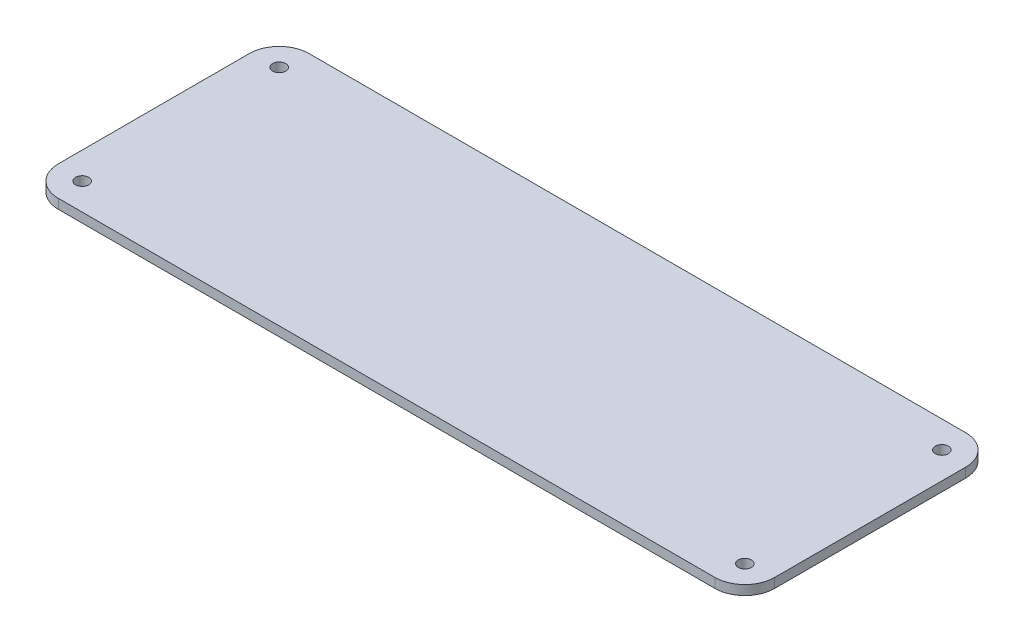
ISO-10303-21;
HEADER;
FILE_DESCRIPTION(('STEP AP214'),'2;1');
FILE_NAME('part.step','',(''),(''),'','','');
FILE_SCHEMA(('AUTOMOTIVE_DESIGN { 1 0 10303 214 1 1 1 1 }'));
ENDSEC;
DATA;
#1=APPLICATION_CONTEXT('core data for automotive mechanical design processes');
#2=APPLICATION_PROTOCOL_DEFINITION('international standard','automotive_design',2000,#1);
#3=PRODUCT_CONTEXT('',#1,'mechanical');
#4=PRODUCT('Part','Part','',(#3));
#5=PRODUCT_RELATED_PRODUCT_CATEGORY('part','',(#4));
#6=PRODUCT_DEFINITION_FORMATION('','',#4);
#7=PRODUCT_DEFINITION_CONTEXT('part definition',#1,'design');
#8=PRODUCT_DEFINITION('design','',#6,#7);
#9=PRODUCT_DEFINITION_SHAPE('','',#8);
#10=(LENGTH_UNIT() NAMED_UNIT(*) SI_UNIT(.MILLI.,.METRE.));
#11=(NAMED_UNIT(*) PLANE_ANGLE_UNIT() SI_UNIT($,.RADIAN.));
#12=(NAMED_UNIT(*) SI_UNIT($,.STERADIAN.) SOLID_ANGLE_UNIT());
#13=UNCERTAINTY_MEASURE_WITH_UNIT(LENGTH_MEASURE(1.E-05),#10,'distance_accuracy_value','');
#14=(GEOMETRIC_REPRESENTATION_CONTEXT(3) GLOBAL_UNCERTAINTY_ASSIGNED_CONTEXT((#13)) GLOBAL_UNIT_ASSIGNED_CONTEXT((#10,
#11,#12)) REPRESENTATION_CONTEXT('',''));
#15=CARTESIAN_POINT('',(0.,0.,0.));
#16=DIRECTION('',(0.,0.,1.));
#17=DIRECTION('',(1.,0.,0.));
#18=AXIS2_PLACEMENT_3D('',#15,#16,#17);
#19=CARTESIAN_POINT('',(-55.,1.6,16.));
#20=DIRECTION('',(0.,-1.,0.));
#21=DIRECTION('',(0.,0.,-1.));
#22=AXIS2_PLACEMENT_3D('',#19,#20,#21);
#23=CYLINDRICAL_SURFACE('',#22,5.);
#24=CARTESIAN_POINT('',(-55.,0.,16.));
#25=DIRECTION('',(0.,1.,0.));
#26=DIRECTION('',(0.,0.,1.));
#27=AXIS2_PLACEMENT_3D('',#24,#25,#26);
#28=CIRCLE('',#27,5.);
#29=CARTESIAN_POINT('',(-60.,0.,16.));
#30=VERTEX_POINT('',#29);
#31=CARTESIAN_POINT('',(-55.,0.,21.));
#32=VERTEX_POINT('',#31);
#33=EDGE_CURVE('E129',#30,#32,#28,.T.);
#34=ORIENTED_EDGE('',*,*,#33,.T.);
#35=DIRECTION('',(0.,-1.,0.));
#36=VECTOR('',#35,1.);
#37=CARTESIAN_POINT('',(-55.,1.6,21.));
#38=LINE('',#37,#36);
#39=CARTESIAN_POINT('',(-55.,1.6,21.));
#40=VERTEX_POINT('',#39);
#41=EDGE_CURVE('E11',#40,#32,#38,.T.);
#42=ORIENTED_EDGE('',*,*,#41,.F.);
#43=CARTESIAN_POINT('',(-55.,1.6,16.));
#44=DIRECTION('',(0.,1.,0.));
#45=DIRECTION('',(0.,0.,1.));
#46=AXIS2_PLACEMENT_3D('',#43,#44,#45);
#47=CIRCLE('',#46,5.);
#48=CARTESIAN_POINT('',(-60.,1.6,16.));
#49=VERTEX_POINT('',#48);
#50=EDGE_CURVE('E144',#49,#40,#47,.T.);
#51=ORIENTED_EDGE('',*,*,#50,.F.);
#52=DIRECTION('',(0.,-1.,0.));
#53=VECTOR('',#52,1.);
#54=CARTESIAN_POINT('',(-60.,1.6,16.));
#55=LINE('',#54,#53);
#56=EDGE_CURVE('E125',#49,#30,#55,.T.);
#57=ORIENTED_EDGE('',*,*,#56,.T.);
#58=EDGE_LOOP('',(#34,#42,#51,#57));
#59=FACE_BOUND('',#58,.T.);
#60=ADVANCED_FACE('F33',(#59),#23,.T.);
#61=CARTESIAN_POINT('',(-55.,1.6,21.));
#62=DIRECTION('',(0.,0.,-1.));
#63=DIRECTION('',(-1.,0.,0.));
#64=AXIS2_PLACEMENT_3D('',#61,#62,#63);
#65=PLANE('',#64);
#66=DIRECTION('',(1.,0.,0.));
#67=VECTOR('',#66,1.);
#68=CARTESIAN_POINT('',(-55.,0.,21.));
#69=LINE('',#68,#67);
#70=CARTESIAN_POINT('',(55.,0.,21.));
#71=VERTEX_POINT('',#70);
#72=EDGE_CURVE('E132',#32,#71,#69,.T.);
#73=ORIENTED_EDGE('',*,*,#72,.T.);
#74=DIRECTION('',(0.,-1.,0.));
#75=VECTOR('',#74,1.);
#76=CARTESIAN_POINT('',(55.,1.6,21.));
#77=LINE('',#76,#75);
#78=CARTESIAN_POINT('',(55.,1.6,21.));
#79=VERTEX_POINT('',#78);
#80=EDGE_CURVE('E41',#79,#71,#77,.T.);
#81=ORIENTED_EDGE('',*,*,#80,.F.);
#82=DIRECTION('',(1.,0.,0.));
#83=VECTOR('',#82,1.);
#84=CARTESIAN_POINT('',(-55.,1.6,21.));
#85=LINE('',#84,#83);
#86=EDGE_CURVE('E92',#40,#79,#85,.T.);
#87=ORIENTED_EDGE('',*,*,#86,.F.);
#88=ORIENTED_EDGE('',*,*,#41,.T.);
#89=EDGE_LOOP('',(#73,#81,#87,#88));
#90=FACE_BOUND('',#89,.T.);
#91=ADVANCED_FACE('F230',(#90),#65,.F.);
#92=CARTESIAN_POINT('',(55.,1.6,16.));
#93=DIRECTION('',(0.,-1.,0.));
#94=DIRECTION('',(0.,0.,-1.));
#95=AXIS2_PLACEMENT_3D('',#92,#93,#94);
#96=CYLINDRICAL_SURFACE('',#95,5.);
#97=CARTESIAN_POINT('',(55.,0.,16.));
#98=DIRECTION('',(0.,1.,0.));
#99=DIRECTION('',(0.,0.,1.));
#100=AXIS2_PLACEMENT_3D('',#97,#98,#99);
#101=CIRCLE('',#100,5.);
#102=CARTESIAN_POINT('',(60.,0.,16.));
#103=VERTEX_POINT('',#102);
#104=EDGE_CURVE('E135',#71,#103,#101,.T.);
#105=ORIENTED_EDGE('',*,*,#104,.T.);
#106=DIRECTION('',(0.,-1.,0.));
#107=VECTOR('',#106,1.);
#108=CARTESIAN_POINT('',(60.,1.6,16.));
#109=LINE('',#108,#107);
#110=CARTESIAN_POINT('',(60.,1.6,16.));
#111=VERTEX_POINT('',#110);
#112=EDGE_CURVE('E151',#111,#103,#109,.T.);
#113=ORIENTED_EDGE('',*,*,#112,.F.);
#114=CARTESIAN_POINT('',(55.,1.6,16.));
#115=DIRECTION('',(0.,1.,0.));
#116=DIRECTION('',(0.,0.,1.));
#117=AXIS2_PLACEMENT_3D('',#114,#115,#116);
#118=CIRCLE('',#117,5.);
#119=EDGE_CURVE('E159',#79,#111,#118,.T.);
#120=ORIENTED_EDGE('',*,*,#119,.F.);
#121=ORIENTED_EDGE('',*,*,#80,.T.);
#122=EDGE_LOOP('',(#105,#113,#120,#121));
#123=FACE_BOUND('',#122,.T.);
#124=ADVANCED_FACE('F157',(#123),#96,.T.);
#125=CARTESIAN_POINT('',(60.,1.6,-16.));
#126=DIRECTION('',(-1.,0.,0.));
#127=DIRECTION('',(0.,0.,1.));
#128=AXIS2_PLACEMENT_3D('',#125,#126,#127);
#129=PLANE('',#128);
#130=DIRECTION('',(0.,0.,-1.));
#131=VECTOR('',#130,1.);
#132=CARTESIAN_POINT('',(60.,0.,-16.));
#133=LINE('',#132,#131);
#134=CARTESIAN_POINT('',(60.,0.,-16.));
#135=VERTEX_POINT('',#134);
#136=EDGE_CURVE('E137',#103,#135,#133,.T.);
#137=ORIENTED_EDGE('',*,*,#136,.T.);
#138=DIRECTION('',(0.,-1.,0.));
#139=VECTOR('',#138,1.);
#140=CARTESIAN_POINT('',(60.,1.6,-16.));
#141=LINE('',#140,#139);
#142=CARTESIAN_POINT('',(60.,1.6,-16.));
#143=VERTEX_POINT('',#142);
#144=EDGE_CURVE('E148',#143,#135,#141,.T.);
#145=ORIENTED_EDGE('',*,*,#144,.F.);
#146=DIRECTION('',(0.,0.,-1.));
#147=VECTOR('',#146,1.);
#148=CARTESIAN_POINT('',(60.,1.6,-16.));
#149=LINE('',#148,#147);
#150=EDGE_CURVE('E171',#111,#143,#149,.T.);
#151=ORIENTED_EDGE('',*,*,#150,.F.);
#152=ORIENTED_EDGE('',*,*,#112,.T.);
#153=EDGE_LOOP('',(#137,#145,#151,#152));
#154=FACE_BOUND('',#153,.T.);
#155=ADVANCED_FACE('F167',(#154),#129,.F.);
#156=CARTESIAN_POINT('',(55.,1.6,-16.));
#157=DIRECTION('',(0.,-1.,0.));
#158=DIRECTION('',(0.,0.,-1.));
#159=AXIS2_PLACEMENT_3D('',#156,#157,#158);
#160=CYLINDRICAL_SURFACE('',#159,5.);
#161=CARTESIAN_POINT('',(55.,0.,-16.));
#162=DIRECTION('',(0.,1.,0.));
#163=DIRECTION('',(0.,0.,-1.));
#164=AXIS2_PLACEMENT_3D('',#161,#162,#163);
#165=CIRCLE('',#164,5.);
#166=CARTESIAN_POINT('',(55.,0.,-21.));
#167=VERTEX_POINT('',#166);
#168=EDGE_CURVE('E139',#135,#167,#165,.T.);
#169=ORIENTED_EDGE('',*,*,#168,.T.);
#170=DIRECTION('',(0.,-1.,0.));
#171=VECTOR('',#170,1.);
#172=CARTESIAN_POINT('',(55.,1.6,-21.));
#173=LINE('',#172,#171);
#174=CARTESIAN_POINT('',(55.,1.6,-21.));
#175=VERTEX_POINT('',#174);
#176=EDGE_CURVE('E120',#175,#167,#173,.T.);
#177=ORIENTED_EDGE('',*,*,#176,.F.);
#178=CARTESIAN_POINT('',(55.,1.6,-16.));
#179=DIRECTION('',(0.,1.,0.));
#180=DIRECTION('',(0.,0.,-1.));
#181=AXIS2_PLACEMENT_3D('',#178,#179,#180);
#182=CIRCLE('',#181,5.);
#183=EDGE_CURVE('E111',#143,#175,#182,.T.);
#184=ORIENTED_EDGE('',*,*,#183,.F.);
#185=ORIENTED_EDGE('',*,*,#144,.T.);
#186=EDGE_LOOP('',(#169,#177,#184,#185));
#187=FACE_BOUND('',#186,.T.);
#188=ADVANCED_FACE('F170',(#187),#160,.T.);
#189=CARTESIAN_POINT('',(-55.,1.6,-21.));
#190=DIRECTION('',(0.,0.,1.));
#191=DIRECTION('',(1.,0.,0.));
#192=AXIS2_PLACEMENT_3D('',#189,#190,#191);
#193=PLANE('',#192);
#194=DIRECTION('',(-1.,0.,0.));
#195=VECTOR('',#194,1.);
#196=CARTESIAN_POINT('',(-55.,0.,-21.));
#197=LINE('',#196,#195);
#198=CARTESIAN_POINT('',(-55.,0.,-21.));
#199=VERTEX_POINT('',#198);
#200=EDGE_CURVE('E119',#167,#199,#197,.T.);
#201=ORIENTED_EDGE('',*,*,#200,.T.);
#202=DIRECTION('',(0.,-1.,0.));
#203=VECTOR('',#202,1.);
#204=CARTESIAN_POINT('',(-55.,1.6,-21.));
#205=LINE('',#204,#203);
#206=CARTESIAN_POINT('',(-55.,1.6,-21.));
#207=VERTEX_POINT('',#206);
#208=EDGE_CURVE('E116',#207,#199,#205,.T.);
#209=ORIENTED_EDGE('',*,*,#208,.F.);
#210=DIRECTION('',(-1.,0.,0.));
#211=VECTOR('',#210,1.);
#212=CARTESIAN_POINT('',(-55.,1.6,-21.));
#213=LINE('',#212,#211);
#214=EDGE_CURVE('E105',#175,#207,#213,.T.);
#215=ORIENTED_EDGE('',*,*,#214,.F.);
#216=ORIENTED_EDGE('',*,*,#176,.T.);
#217=EDGE_LOOP('',(#201,#209,#215,#216));
#218=FACE_BOUND('',#217,.T.);
#219=ADVANCED_FACE('F117',(#218),#193,.F.);
#220=CARTESIAN_POINT('',(-55.,1.6,-16.));
#221=DIRECTION('',(0.,-1.,0.));
#222=DIRECTION('',(0.,0.,-1.));
#223=AXIS2_PLACEMENT_3D('',#220,#221,#222);
#224=CYLINDRICAL_SURFACE('',#223,5.);
#225=CARTESIAN_POINT('',(-55.,0.,-16.));
#226=DIRECTION('',(0.,1.,0.));
#227=DIRECTION('',(0.,0.,1.));
#228=AXIS2_PLACEMENT_3D('',#225,#226,#227);
#229=CIRCLE('',#228,5.);
#230=CARTESIAN_POINT('',(-60.,0.,-16.));
#231=VERTEX_POINT('',#230);
#232=EDGE_CURVE('E78',#199,#231,#229,.T.);
#233=ORIENTED_EDGE('',*,*,#232,.T.);
#234=DIRECTION('',(0.,-1.,0.));
#235=VECTOR('',#234,1.);
#236=CARTESIAN_POINT('',(-60.,1.6,-16.));
#237=LINE('',#236,#235);
#238=CARTESIAN_POINT('',(-60.,1.6,-16.));
#239=VERTEX_POINT('',#238);
#240=EDGE_CURVE('E121',#239,#231,#237,.T.);
#241=ORIENTED_EDGE('',*,*,#240,.F.);
#242=CARTESIAN_POINT('',(-55.,1.6,-16.));
#243=DIRECTION('',(0.,1.,0.));
#244=DIRECTION('',(0.,0.,1.));
#245=AXIS2_PLACEMENT_3D('',#242,#243,#244);
#246=CIRCLE('',#245,5.);
#247=EDGE_CURVE('E109',#207,#239,#246,.T.);
#248=ORIENTED_EDGE('',*,*,#247,.F.);
#249=ORIENTED_EDGE('',*,*,#208,.T.);
#250=EDGE_LOOP('',(#233,#241,#248,#249));
#251=FACE_BOUND('',#250,.T.);
#252=ADVANCED_FACE('F123',(#251),#224,.T.);
#253=CARTESIAN_POINT('',(-60.,1.6,-16.));
#254=DIRECTION('',(1.,0.,0.));
#255=DIRECTION('',(0.,0.,-1.));
#256=AXIS2_PLACEMENT_3D('',#253,#254,#255);
#257=PLANE('',#256);
#258=DIRECTION('',(0.,0.,1.));
#259=VECTOR('',#258,1.);
#260=CARTESIAN_POINT('',(-60.,0.,-16.));
#261=LINE('',#260,#259);
#262=EDGE_CURVE('E84',#231,#30,#261,.T.);
#263=ORIENTED_EDGE('',*,*,#262,.T.);
#264=ORIENTED_EDGE('',*,*,#56,.F.);
#265=DIRECTION('',(0.,0.,1.));
#266=VECTOR('',#265,1.);
#267=CARTESIAN_POINT('',(-60.,1.6,-16.));
#268=LINE('',#267,#266);
#269=EDGE_CURVE('E49',#239,#49,#268,.T.);
#270=ORIENTED_EDGE('',*,*,#269,.F.);
#271=ORIENTED_EDGE('',*,*,#240,.T.);
#272=EDGE_LOOP('',(#263,#264,#270,#271));
#273=FACE_BOUND('',#272,.T.);
#274=ADVANCED_FACE('F213',(#273),#257,.F.);
#275=CARTESIAN_POINT('',(-55.,1.6,16.));
#276=DIRECTION('',(0.,1.,0.));
#277=DIRECTION('',(0.,0.,1.));
#278=AXIS2_PLACEMENT_3D('',#275,#276,#277);
#279=PLANE('',#278);
#280=CARTESIAN_POINT('',(-55.5,1.6,16.5));
#281=DIRECTION('',(0.,1.,0.));
#282=DIRECTION('',(0.,0.,1.));
#283=AXIS2_PLACEMENT_3D('',#280,#281,#282);
#284=CIRCLE('',#283,1.1);
#285=CARTESIAN_POINT('',(-55.5,1.6,17.6));
#286=VERTEX_POINT('',#285);
#287=EDGE_CURVE('E190',#286,#286,#284,.T.);
#288=ORIENTED_EDGE('',*,*,#287,.F.);
#289=EDGE_LOOP('',(#288));
#290=FACE_BOUND('',#289,.T.);
#291=CARTESIAN_POINT('',(55.5,1.6,-16.5));
#292=DIRECTION('',(0.,1.,0.));
#293=DIRECTION('',(0.,0.,1.));
#294=AXIS2_PLACEMENT_3D('',#291,#292,#293);
#295=CIRCLE('',#294,1.1);
#296=CARTESIAN_POINT('',(55.5,1.6,-15.4));
#297=VERTEX_POINT('',#296);
#298=EDGE_CURVE('E183',#297,#297,#295,.T.);
#299=ORIENTED_EDGE('',*,*,#298,.F.);
#300=EDGE_LOOP('',(#299));
#301=FACE_BOUND('',#300,.T.);
#302=CARTESIAN_POINT('',(55.5,1.6,16.5));
#303=DIRECTION('',(0.,1.,0.));
#304=DIRECTION('',(0.,0.,1.));
#305=AXIS2_PLACEMENT_3D('',#302,#303,#304);
#306=CIRCLE('',#305,1.1);
#307=CARTESIAN_POINT('',(55.5,1.6,17.6));
#308=VERTEX_POINT('',#307);
#309=EDGE_CURVE('E195',#308,#308,#306,.T.);
#310=ORIENTED_EDGE('',*,*,#309,.F.);
#311=EDGE_LOOP('',(#310));
#312=FACE_BOUND('',#311,.T.);
#313=CARTESIAN_POINT('',(-55.5,1.6,-16.5));
#314=DIRECTION('',(0.,1.,0.));
#315=DIRECTION('',(0.,0.,1.));
#316=AXIS2_PLACEMENT_3D('',#313,#314,#315);
#317=CIRCLE('',#316,1.10000000000001);
#318=CARTESIAN_POINT('',(-55.5,1.6,-15.4));
#319=VERTEX_POINT('',#318);
#320=EDGE_CURVE('E177',#319,#319,#317,.T.);
#321=ORIENTED_EDGE('',*,*,#320,.F.);
#322=EDGE_LOOP('',(#321));
#323=FACE_BOUND('',#322,.T.);
#324=ORIENTED_EDGE('',*,*,#50,.T.);
#325=ORIENTED_EDGE('',*,*,#86,.T.);
#326=ORIENTED_EDGE('',*,*,#119,.T.);
#327=ORIENTED_EDGE('',*,*,#150,.T.);
#328=ORIENTED_EDGE('',*,*,#183,.T.);
#329=ORIENTED_EDGE('',*,*,#214,.T.);
#330=ORIENTED_EDGE('',*,*,#247,.T.);
#331=ORIENTED_EDGE('',*,*,#269,.T.);
#332=EDGE_LOOP('',(#324,#325,#326,#327,#328,#329,#330,#331));
#333=FACE_BOUND('',#332,.T.);
#334=ADVANCED_FACE('F107',(#290,#301,#312,#323,#333),#279,.T.);
#335=CARTESIAN_POINT('',(-55.,0.,16.));
#336=DIRECTION('',(0.,1.,0.));
#337=DIRECTION('',(0.,0.,1.));
#338=AXIS2_PLACEMENT_3D('',#335,#336,#337);
#339=PLANE('',#338);
#340=CARTESIAN_POINT('',(-55.5,0.,16.5));
#341=DIRECTION('',(0.,1.,0.));
#342=DIRECTION('',(0.,0.,1.));
#343=AXIS2_PLACEMENT_3D('',#340,#341,#342);
#344=CIRCLE('',#343,1.1);
#345=CARTESIAN_POINT('',(-55.5,0.,17.6));
#346=VERTEX_POINT('',#345);
#347=EDGE_CURVE('E180',#346,#346,#344,.T.);
#348=ORIENTED_EDGE('',*,*,#347,.T.);
#349=EDGE_LOOP('',(#348));
#350=FACE_BOUND('',#349,.T.);
#351=CARTESIAN_POINT('',(55.5,0.,-16.5));
#352=DIRECTION('',(0.,1.,0.));
#353=DIRECTION('',(0.,0.,1.));
#354=AXIS2_PLACEMENT_3D('',#351,#352,#353);
#355=CIRCLE('',#354,1.1);
#356=CARTESIAN_POINT('',(55.5,0.,-15.4));
#357=VERTEX_POINT('',#356);
#358=EDGE_CURVE('E186',#357,#357,#355,.T.);
#359=ORIENTED_EDGE('',*,*,#358,.T.);
#360=EDGE_LOOP('',(#359));
#361=FACE_BOUND('',#360,.T.);
#362=CARTESIAN_POINT('',(55.5,0.,16.5));
#363=DIRECTION('',(0.,1.,0.));
#364=DIRECTION('',(0.,0.,1.));
#365=AXIS2_PLACEMENT_3D('',#362,#363,#364);
#366=CIRCLE('',#365,1.1);
#367=CARTESIAN_POINT('',(55.5,0.,17.6));
#368=VERTEX_POINT('',#367);
#369=EDGE_CURVE('E187',#368,#368,#366,.T.);
#370=ORIENTED_EDGE('',*,*,#369,.T.);
#371=EDGE_LOOP('',(#370));
#372=FACE_BOUND('',#371,.T.);
#373=CARTESIAN_POINT('',(-55.5,0.,-16.5));
#374=DIRECTION('',(0.,1.,0.));
#375=DIRECTION('',(0.,0.,1.));
#376=AXIS2_PLACEMENT_3D('',#373,#374,#375);
#377=CIRCLE('',#376,1.10000000000001);
#378=CARTESIAN_POINT('',(-55.5,0.,-15.4));
#379=VERTEX_POINT('',#378);
#380=EDGE_CURVE('E133',#379,#379,#377,.T.);
#381=ORIENTED_EDGE('',*,*,#380,.T.);
#382=EDGE_LOOP('',(#381));
#383=FACE_BOUND('',#382,.T.);
#384=ORIENTED_EDGE('',*,*,#33,.F.);
#385=ORIENTED_EDGE('',*,*,#262,.F.);
#386=ORIENTED_EDGE('',*,*,#232,.F.);
#387=ORIENTED_EDGE('',*,*,#200,.F.);
#388=ORIENTED_EDGE('',*,*,#168,.F.);
#389=ORIENTED_EDGE('',*,*,#136,.F.);
#390=ORIENTED_EDGE('',*,*,#104,.F.);
#391=ORIENTED_EDGE('',*,*,#72,.F.);
#392=EDGE_LOOP('',(#384,#385,#386,#387,#388,#389,#390,#391));
#393=FACE_BOUND('',#392,.T.);
#394=ADVANCED_FACE('F163',(#350,#361,#372,#383,#393),#339,.F.);
#395=CARTESIAN_POINT('',(-55.5,0.,-16.5));
#396=DIRECTION('',(0.,1.,0.));
#397=DIRECTION('',(0.,0.,1.));
#398=AXIS2_PLACEMENT_3D('',#395,#396,#397);
#399=CYLINDRICAL_SURFACE('',#398,1.10000000000001);
#400=ORIENTED_EDGE('',*,*,#380,.F.);
#401=EDGE_LOOP('',(#400));
#402=FACE_BOUND('',#401,.T.);
#403=ORIENTED_EDGE('',*,*,#320,.T.);
#404=EDGE_LOOP('',(#403));
#405=FACE_BOUND('',#404,.T.);
#406=ADVANCED_FACE('F207',(#402,#405),#399,.F.);
#407=CARTESIAN_POINT('',(55.5,0.,16.5));
#408=DIRECTION('',(0.,1.,0.));
#409=DIRECTION('',(0.,0.,1.));
#410=AXIS2_PLACEMENT_3D('',#407,#408,#409);
#411=CYLINDRICAL_SURFACE('',#410,1.1);
#412=ORIENTED_EDGE('',*,*,#369,.F.);
#413=EDGE_LOOP('',(#412));
#414=FACE_BOUND('',#413,.T.);
#415=ORIENTED_EDGE('',*,*,#309,.T.);
#416=EDGE_LOOP('',(#415));
#417=FACE_BOUND('',#416,.T.);
#418=ADVANCED_FACE('F203',(#414,#417),#411,.F.);
#419=CARTESIAN_POINT('',(55.5,0.,-16.5));
#420=DIRECTION('',(0.,1.,0.));
#421=DIRECTION('',(0.,0.,1.));
#422=AXIS2_PLACEMENT_3D('',#419,#420,#421);
#423=CYLINDRICAL_SURFACE('',#422,1.1);
#424=ORIENTED_EDGE('',*,*,#358,.F.);
#425=EDGE_LOOP('',(#424));
#426=FACE_BOUND('',#425,.T.);
#427=ORIENTED_EDGE('',*,*,#298,.T.);
#428=EDGE_LOOP('',(#427));
#429=FACE_BOUND('',#428,.T.);
#430=ADVANCED_FACE('F206',(#426,#429),#423,.F.);
#431=CARTESIAN_POINT('',(-55.5,0.,16.5));
#432=DIRECTION('',(0.,1.,0.));
#433=DIRECTION('',(0.,0.,1.));
#434=AXIS2_PLACEMENT_3D('',#431,#432,#433);
#435=CYLINDRICAL_SURFACE('',#434,1.1);
#436=ORIENTED_EDGE('',*,*,#347,.F.);
#437=EDGE_LOOP('',(#436));
#438=FACE_BOUND('',#437,.T.);
#439=ORIENTED_EDGE('',*,*,#287,.T.);
#440=EDGE_LOOP('',(#439));
#441=FACE_BOUND('',#440,.T.);
#442=ADVANCED_FACE('F301',(#438,#441),#435,.F.);
#443=CLOSED_SHELL('',(#60,#91,#124,#155,#188,#219,#252,#274,#334,#394,#406,#418,#430,#442));
#444=MANIFOLD_SOLID_BREP('B2',#443);
#445=ADVANCED_BREP_SHAPE_REPRESENTATION('',(#18,#444),#14);
#446=SHAPE_DEFINITION_REPRESENTATION(#9,#445);
ENDSEC;
END-ISO-10303-21;
